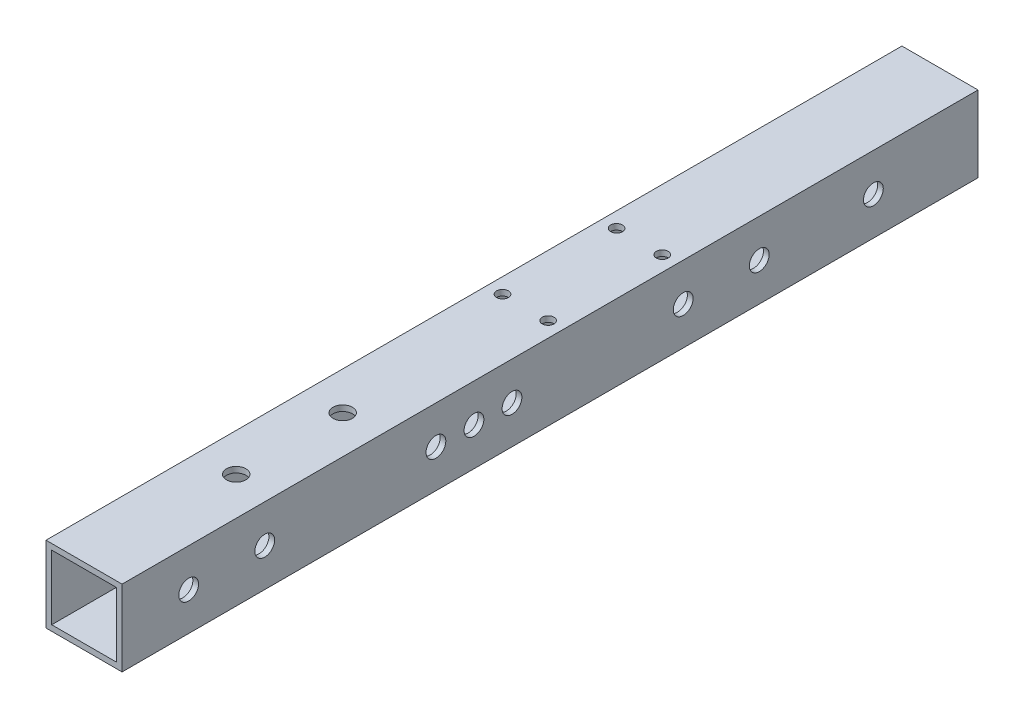
ISO-10303-21;
HEADER;
FILE_DESCRIPTION(('STEP AP214'),'2;1');
FILE_NAME('part.step','',(''),(''),'','','');
FILE_SCHEMA(('AUTOMOTIVE_DESIGN { 1 0 10303 214 1 1 1 1 }'));
ENDSEC;
DATA;
#1=APPLICATION_CONTEXT('core data for automotive mechanical design processes');
#2=APPLICATION_PROTOCOL_DEFINITION('international standard','automotive_design',2000,#1);
#3=PRODUCT_CONTEXT('',#1,'mechanical');
#4=PRODUCT('Part','Part','',(#3));
#5=PRODUCT_RELATED_PRODUCT_CATEGORY('part','',(#4));
#6=PRODUCT_DEFINITION_FORMATION('','',#4);
#7=PRODUCT_DEFINITION_CONTEXT('part definition',#1,'design');
#8=PRODUCT_DEFINITION('design','',#6,#7);
#9=PRODUCT_DEFINITION_SHAPE('','',#8);
#10=(LENGTH_UNIT() NAMED_UNIT(*) SI_UNIT(.MILLI.,.METRE.));
#11=(NAMED_UNIT(*) PLANE_ANGLE_UNIT() SI_UNIT($,.RADIAN.));
#12=(NAMED_UNIT(*) SI_UNIT($,.STERADIAN.) SOLID_ANGLE_UNIT());
#13=UNCERTAINTY_MEASURE_WITH_UNIT(LENGTH_MEASURE(1.E-05),#10,'distance_accuracy_value','');
#14=(GEOMETRIC_REPRESENTATION_CONTEXT(3) GLOBAL_UNCERTAINTY_ASSIGNED_CONTEXT((#13)) GLOBAL_UNIT_ASSIGNED_CONTEXT((#10,
#11,#12)) REPRESENTATION_CONTEXT('',''));
#15=CARTESIAN_POINT('',(0.,0.,0.));
#16=DIRECTION('',(0.,0.,1.));
#17=DIRECTION('',(1.,0.,0.));
#18=AXIS2_PLACEMENT_3D('',#15,#16,#17);
#19=CARTESIAN_POINT('',(0.,0.,112.5));
#20=DIRECTION('',(0.,0.,1.));
#21=DIRECTION('',(1.,0.,0.));
#22=AXIS2_PLACEMENT_3D('',#19,#20,#21);
#23=PLANE('',#22);
#24=DIRECTION('',(0.,1.,0.));
#25=VECTOR('',#24,1.);
#26=CARTESIAN_POINT('',(10.,10.,112.5));
#27=LINE('',#26,#25);
#28=CARTESIAN_POINT('',(10.,-10.,112.5));
#29=VERTEX_POINT('',#28);
#30=CARTESIAN_POINT('',(10.,10.,112.5));
#31=VERTEX_POINT('',#30);
#32=EDGE_CURVE('E142',#29,#31,#27,.T.);
#33=ORIENTED_EDGE('',*,*,#32,.T.);
#34=DIRECTION('',(-1.,0.,0.));
#35=VECTOR('',#34,1.);
#36=CARTESIAN_POINT('',(-10.,10.,112.5));
#37=LINE('',#36,#35);
#38=CARTESIAN_POINT('',(-10.,10.,112.5));
#39=VERTEX_POINT('',#38);
#40=EDGE_CURVE('E145',#31,#39,#37,.T.);
#41=ORIENTED_EDGE('',*,*,#40,.T.);
#42=DIRECTION('',(0.,-1.,0.));
#43=VECTOR('',#42,1.);
#44=CARTESIAN_POINT('',(-10.,10.,112.5));
#45=LINE('',#44,#43);
#46=CARTESIAN_POINT('',(-10.,-10.,112.5));
#47=VERTEX_POINT('',#46);
#48=EDGE_CURVE('E148',#39,#47,#45,.T.);
#49=ORIENTED_EDGE('',*,*,#48,.T.);
#50=DIRECTION('',(1.,0.,0.));
#51=VECTOR('',#50,1.);
#52=CARTESIAN_POINT('',(-10.,-10.,112.5));
#53=LINE('',#52,#51);
#54=EDGE_CURVE('E150',#47,#29,#53,.T.);
#55=ORIENTED_EDGE('',*,*,#54,.T.);
#56=EDGE_LOOP('',(#33,#41,#49,#55));
#57=FACE_BOUND('',#56,.T.);
#58=DIRECTION('',(1.,0.,0.));
#59=VECTOR('',#58,1.);
#60=CARTESIAN_POINT('',(-8.5,-8.5,112.5));
#61=LINE('',#60,#59);
#62=CARTESIAN_POINT('',(-8.5,-8.5,112.5));
#63=VERTEX_POINT('',#62);
#64=CARTESIAN_POINT('',(8.5,-8.5,112.5));
#65=VERTEX_POINT('',#64);
#66=EDGE_CURVE('E112',#63,#65,#61,.T.);
#67=ORIENTED_EDGE('',*,*,#66,.F.);
#68=DIRECTION('',(0.,-1.,0.));
#69=VECTOR('',#68,1.);
#70=CARTESIAN_POINT('',(-8.5,8.5,112.5));
#71=LINE('',#70,#69);
#72=CARTESIAN_POINT('',(-8.5,8.5,112.5));
#73=VERTEX_POINT('',#72);
#74=EDGE_CURVE('E104',#73,#63,#71,.T.);
#75=ORIENTED_EDGE('',*,*,#74,.F.);
#76=DIRECTION('',(-1.,0.,0.));
#77=VECTOR('',#76,1.);
#78=CARTESIAN_POINT('',(-8.5,8.5,112.5));
#79=LINE('',#78,#77);
#80=CARTESIAN_POINT('',(8.5,8.5,112.5));
#81=VERTEX_POINT('',#80);
#82=EDGE_CURVE('E126',#81,#73,#79,.T.);
#83=ORIENTED_EDGE('',*,*,#82,.F.);
#84=DIRECTION('',(0.,1.,0.));
#85=VECTOR('',#84,1.);
#86=CARTESIAN_POINT('',(8.5,8.5,112.5));
#87=LINE('',#86,#85);
#88=EDGE_CURVE('E124',#65,#81,#87,.T.);
#89=ORIENTED_EDGE('',*,*,#88,.F.);
#90=EDGE_LOOP('',(#67,#75,#83,#89));
#91=FACE_BOUND('',#90,.T.);
#92=ADVANCED_FACE('F37',(#57,#91),#23,.T.);
#93=CARTESIAN_POINT('',(0.,0.,-112.5));
#94=DIRECTION('',(0.,0.,1.));
#95=DIRECTION('',(1.,0.,0.));
#96=AXIS2_PLACEMENT_3D('',#93,#94,#95);
#97=PLANE('',#96);
#98=DIRECTION('',(0.,1.,0.));
#99=VECTOR('',#98,1.);
#100=CARTESIAN_POINT('',(10.,10.,-112.5));
#101=LINE('',#100,#99);
#102=CARTESIAN_POINT('',(10.,-10.,-112.5));
#103=VERTEX_POINT('',#102);
#104=CARTESIAN_POINT('',(10.,10.,-112.5));
#105=VERTEX_POINT('',#104);
#106=EDGE_CURVE('E120',#103,#105,#101,.T.);
#107=ORIENTED_EDGE('',*,*,#106,.F.);
#108=DIRECTION('',(1.,0.,0.));
#109=VECTOR('',#108,1.);
#110=CARTESIAN_POINT('',(-10.,-10.,-112.5));
#111=LINE('',#110,#109);
#112=CARTESIAN_POINT('',(-10.,-10.,-112.5));
#113=VERTEX_POINT('',#112);
#114=EDGE_CURVE('E146',#113,#103,#111,.T.);
#115=ORIENTED_EDGE('',*,*,#114,.F.);
#116=DIRECTION('',(0.,-1.,0.));
#117=VECTOR('',#116,1.);
#118=CARTESIAN_POINT('',(-10.,10.,-112.5));
#119=LINE('',#118,#117);
#120=CARTESIAN_POINT('',(-10.,10.,-112.5));
#121=VERTEX_POINT('',#120);
#122=EDGE_CURVE('E157',#121,#113,#119,.T.);
#123=ORIENTED_EDGE('',*,*,#122,.F.);
#124=DIRECTION('',(-1.,0.,0.));
#125=VECTOR('',#124,1.);
#126=CARTESIAN_POINT('',(-10.,10.,-112.5));
#127=LINE('',#126,#125);
#128=EDGE_CURVE('E155',#105,#121,#127,.T.);
#129=ORIENTED_EDGE('',*,*,#128,.F.);
#130=EDGE_LOOP('',(#107,#115,#123,#129));
#131=FACE_BOUND('',#130,.T.);
#132=DIRECTION('',(0.,-1.,0.));
#133=VECTOR('',#132,1.);
#134=CARTESIAN_POINT('',(-8.5,8.5,-112.5));
#135=LINE('',#134,#133);
#136=CARTESIAN_POINT('',(-8.5,8.5,-112.5));
#137=VERTEX_POINT('',#136);
#138=CARTESIAN_POINT('',(-8.5,-8.5,-112.5));
#139=VERTEX_POINT('',#138);
#140=EDGE_CURVE('E62',#137,#139,#135,.T.);
#141=ORIENTED_EDGE('',*,*,#140,.T.);
#142=DIRECTION('',(1.,0.,0.));
#143=VECTOR('',#142,1.);
#144=CARTESIAN_POINT('',(-8.5,-8.5,-112.5));
#145=LINE('',#144,#143);
#146=CARTESIAN_POINT('',(8.5,-8.5,-112.5));
#147=VERTEX_POINT('',#146);
#148=EDGE_CURVE('E119',#139,#147,#145,.T.);
#149=ORIENTED_EDGE('',*,*,#148,.T.);
#150=DIRECTION('',(0.,1.,0.));
#151=VECTOR('',#150,1.);
#152=CARTESIAN_POINT('',(8.5,8.5,-112.5));
#153=LINE('',#152,#151);
#154=CARTESIAN_POINT('',(8.5,8.5,-112.5));
#155=VERTEX_POINT('',#154);
#156=EDGE_CURVE('E134',#147,#155,#153,.T.);
#157=ORIENTED_EDGE('',*,*,#156,.T.);
#158=DIRECTION('',(-1.,0.,0.));
#159=VECTOR('',#158,1.);
#160=CARTESIAN_POINT('',(-8.5,8.5,-112.5));
#161=LINE('',#160,#159);
#162=EDGE_CURVE('E113',#155,#137,#161,.T.);
#163=ORIENTED_EDGE('',*,*,#162,.T.);
#164=EDGE_LOOP('',(#141,#149,#157,#163));
#165=FACE_BOUND('',#164,.T.);
#166=ADVANCED_FACE('F345',(#131,#165),#97,.F.);
#167=CARTESIAN_POINT('',(10.,10.,112.5));
#168=DIRECTION('',(-1.,0.,0.));
#169=DIRECTION('',(0.,-1.,0.));
#170=AXIS2_PLACEMENT_3D('',#167,#168,#169);
#171=PLANE('',#170);
#172=CARTESIAN_POINT('',(10.,0.,-85.0000000000001));
#173=DIRECTION('',(1.,0.,0.));
#174=DIRECTION('',(0.,1.,0.));
#175=AXIS2_PLACEMENT_3D('',#172,#173,#174);
#176=CIRCLE('',#175,2.59999999999999);
#177=CARTESIAN_POINT('',(10.,2.60000000000002,-85.0000000000001));
#178=VERTEX_POINT('',#177);
#179=EDGE_CURVE('E236',#178,#178,#176,.T.);
#180=ORIENTED_EDGE('',*,*,#179,.F.);
#181=EDGE_LOOP('',(#180));
#182=FACE_BOUND('',#181,.T.);
#183=CARTESIAN_POINT('',(10.,0.,-55.0000000000001));
#184=DIRECTION('',(1.,0.,0.));
#185=DIRECTION('',(0.,1.,0.));
#186=AXIS2_PLACEMENT_3D('',#183,#184,#185);
#187=CIRCLE('',#186,2.6);
#188=CARTESIAN_POINT('',(10.,2.60000000000002,-55.0000000000001));
#189=VERTEX_POINT('',#188);
#190=EDGE_CURVE('E242',#189,#189,#187,.T.);
#191=ORIENTED_EDGE('',*,*,#190,.F.);
#192=EDGE_LOOP('',(#191));
#193=FACE_BOUND('',#192,.T.);
#194=CARTESIAN_POINT('',(10.,0.,-35.0000000000001));
#195=DIRECTION('',(1.,0.,0.));
#196=DIRECTION('',(0.,1.,0.));
#197=AXIS2_PLACEMENT_3D('',#194,#195,#196);
#198=CIRCLE('',#197,2.6);
#199=CARTESIAN_POINT('',(10.,2.60000000000001,-35.0000000000001));
#200=VERTEX_POINT('',#199);
#201=EDGE_CURVE('E248',#200,#200,#198,.T.);
#202=ORIENTED_EDGE('',*,*,#201,.F.);
#203=EDGE_LOOP('',(#202));
#204=FACE_BOUND('',#203,.T.);
#205=CARTESIAN_POINT('',(10.,0.,9.99999999999994));
#206=DIRECTION('',(1.,0.,0.));
#207=DIRECTION('',(0.,1.,0.));
#208=AXIS2_PLACEMENT_3D('',#205,#206,#207);
#209=CIRCLE('',#208,2.6);
#210=CARTESIAN_POINT('',(10.,2.60000000000001,9.99999999999994));
#211=VERTEX_POINT('',#210);
#212=EDGE_CURVE('E254',#211,#211,#209,.T.);
#213=ORIENTED_EDGE('',*,*,#212,.F.);
#214=EDGE_LOOP('',(#213));
#215=FACE_BOUND('',#214,.T.);
#216=CARTESIAN_POINT('',(10.,0.,19.9999999999999));
#217=DIRECTION('',(1.,0.,0.));
#218=DIRECTION('',(0.,1.,0.));
#219=AXIS2_PLACEMENT_3D('',#216,#217,#218);
#220=CIRCLE('',#219,2.6);
#221=CARTESIAN_POINT('',(10.,2.6,19.9999999999999));
#222=VERTEX_POINT('',#221);
#223=EDGE_CURVE('E260',#222,#222,#220,.T.);
#224=ORIENTED_EDGE('',*,*,#223,.F.);
#225=EDGE_LOOP('',(#224));
#226=FACE_BOUND('',#225,.T.);
#227=CARTESIAN_POINT('',(10.,0.,29.9999999999999));
#228=DIRECTION('',(1.,0.,0.));
#229=DIRECTION('',(0.,1.,0.));
#230=AXIS2_PLACEMENT_3D('',#227,#228,#229);
#231=CIRCLE('',#230,2.6);
#232=CARTESIAN_POINT('',(10.,2.6,29.9999999999999));
#233=VERTEX_POINT('',#232);
#234=EDGE_CURVE('E266',#233,#233,#231,.T.);
#235=ORIENTED_EDGE('',*,*,#234,.F.);
#236=EDGE_LOOP('',(#235));
#237=FACE_BOUND('',#236,.T.);
#238=CARTESIAN_POINT('',(10.,0.,75.));
#239=DIRECTION('',(1.,0.,0.));
#240=DIRECTION('',(0.,1.,0.));
#241=AXIS2_PLACEMENT_3D('',#238,#239,#240);
#242=CIRCLE('',#241,2.6);
#243=CARTESIAN_POINT('',(10.,2.6,75.));
#244=VERTEX_POINT('',#243);
#245=EDGE_CURVE('E272',#244,#244,#242,.T.);
#246=ORIENTED_EDGE('',*,*,#245,.F.);
#247=EDGE_LOOP('',(#246));
#248=FACE_BOUND('',#247,.T.);
#249=CARTESIAN_POINT('',(10.,0.,95.));
#250=DIRECTION('',(1.,0.,0.));
#251=DIRECTION('',(0.,1.,0.));
#252=AXIS2_PLACEMENT_3D('',#249,#250,#251);
#253=CIRCLE('',#252,2.6);
#254=CARTESIAN_POINT('',(10.,2.59999999999999,95.));
#255=VERTEX_POINT('',#254);
#256=EDGE_CURVE('E233',#255,#255,#253,.T.);
#257=ORIENTED_EDGE('',*,*,#256,.F.);
#258=EDGE_LOOP('',(#257));
#259=FACE_BOUND('',#258,.T.);
#260=ORIENTED_EDGE('',*,*,#106,.T.);
#261=DIRECTION('',(0.,0.,-1.));
#262=VECTOR('',#261,1.);
#263=CARTESIAN_POINT('',(10.,10.,112.5));
#264=LINE('',#263,#262);
#265=EDGE_CURVE('E11',#31,#105,#264,.T.);
#266=ORIENTED_EDGE('',*,*,#265,.F.);
#267=ORIENTED_EDGE('',*,*,#32,.F.);
#268=DIRECTION('',(0.,0.,-1.));
#269=VECTOR('',#268,1.);
#270=CARTESIAN_POINT('',(10.,-10.,112.5));
#271=LINE('',#270,#269);
#272=EDGE_CURVE('E152',#29,#103,#271,.T.);
#273=ORIENTED_EDGE('',*,*,#272,.T.);
#274=EDGE_LOOP('',(#260,#266,#267,#273));
#275=FACE_BOUND('',#274,.T.);
#276=ADVANCED_FACE('F39',(#182,#193,#204,#215,#226,#237,#248,#259,#275),#171,.F.);
#277=CARTESIAN_POINT('',(-10.,10.,112.5));
#278=DIRECTION('',(0.,-1.,0.));
#279=DIRECTION('',(0.,0.,-1.));
#280=AXIS2_PLACEMENT_3D('',#277,#278,#279);
#281=PLANE('',#280);
#282=CARTESIAN_POINT('',(6.,10.,-3.5));
#283=DIRECTION('',(0.,1.,0.));
#284=DIRECTION('',(0.,0.,1.));
#285=AXIS2_PLACEMENT_3D('',#282,#283,#284);
#286=CIRCLE('',#285,1.55);
#287=CARTESIAN_POINT('',(6.,10.,-1.95));
#288=VERTEX_POINT('',#287);
#289=EDGE_CURVE('E469',#288,#288,#286,.T.);
#290=ORIENTED_EDGE('',*,*,#289,.F.);
#291=EDGE_LOOP('',(#290));
#292=FACE_BOUND('',#291,.T.);
#293=CARTESIAN_POINT('',(-6.,10.,-33.5));
#294=DIRECTION('',(0.,1.,0.));
#295=DIRECTION('',(0.,0.,1.));
#296=AXIS2_PLACEMENT_3D('',#293,#294,#295);
#297=CIRCLE('',#296,1.55);
#298=CARTESIAN_POINT('',(-6.,10.,-31.95));
#299=VERTEX_POINT('',#298);
#300=EDGE_CURVE('E456',#299,#299,#297,.T.);
#301=ORIENTED_EDGE('',*,*,#300,.F.);
#302=EDGE_LOOP('',(#301));
#303=FACE_BOUND('',#302,.T.);
#304=CARTESIAN_POINT('',(6.,10.,-33.5));
#305=DIRECTION('',(0.,1.,0.));
#306=DIRECTION('',(0.,0.,1.));
#307=AXIS2_PLACEMENT_3D('',#304,#305,#306);
#308=CIRCLE('',#307,1.55);
#309=CARTESIAN_POINT('',(6.,10.,-31.95));
#310=VERTEX_POINT('',#309);
#311=EDGE_CURVE('E457',#310,#310,#308,.T.);
#312=ORIENTED_EDGE('',*,*,#311,.F.);
#313=EDGE_LOOP('',(#312));
#314=FACE_BOUND('',#313,.T.);
#315=CARTESIAN_POINT('',(-6.,10.,-3.5));
#316=DIRECTION('',(0.,1.,0.));
#317=DIRECTION('',(0.,0.,1.));
#318=AXIS2_PLACEMENT_3D('',#315,#316,#317);
#319=CIRCLE('',#318,1.55);
#320=CARTESIAN_POINT('',(-6.,10.,-1.95));
#321=VERTEX_POINT('',#320);
#322=EDGE_CURVE('E468',#321,#321,#319,.T.);
#323=ORIENTED_EDGE('',*,*,#322,.F.);
#324=EDGE_LOOP('',(#323));
#325=FACE_BOUND('',#324,.T.);
#326=CARTESIAN_POINT('',(0.,10.,72.5000000000001));
#327=DIRECTION('',(0.,1.,0.));
#328=DIRECTION('',(0.,0.,1.));
#329=AXIS2_PLACEMENT_3D('',#326,#327,#328);
#330=CIRCLE('',#329,2.55);
#331=CARTESIAN_POINT('',(0.,10.,75.0500000000001));
#332=VERTEX_POINT('',#331);
#333=EDGE_CURVE('E299',#332,#332,#330,.T.);
#334=ORIENTED_EDGE('',*,*,#333,.F.);
#335=EDGE_LOOP('',(#334));
#336=FACE_BOUND('',#335,.T.);
#337=CARTESIAN_POINT('',(0.,10.,44.5000000000001));
#338=DIRECTION('',(0.,1.,0.));
#339=DIRECTION('',(0.,0.,1.));
#340=AXIS2_PLACEMENT_3D('',#337,#338,#339);
#341=CIRCLE('',#340,2.55);
#342=CARTESIAN_POINT('',(0.,10.,47.05));
#343=VERTEX_POINT('',#342);
#344=EDGE_CURVE('E296',#343,#343,#341,.T.);
#345=ORIENTED_EDGE('',*,*,#344,.F.);
#346=EDGE_LOOP('',(#345));
#347=FACE_BOUND('',#346,.T.);
#348=ORIENTED_EDGE('',*,*,#128,.T.);
#349=DIRECTION('',(0.,0.,-1.));
#350=VECTOR('',#349,1.);
#351=CARTESIAN_POINT('',(-10.,10.,112.5));
#352=LINE('',#351,#350);
#353=EDGE_CURVE('E46',#39,#121,#352,.T.);
#354=ORIENTED_EDGE('',*,*,#353,.F.);
#355=ORIENTED_EDGE('',*,*,#40,.F.);
#356=ORIENTED_EDGE('',*,*,#265,.T.);
#357=EDGE_LOOP('',(#348,#354,#355,#356));
#358=FACE_BOUND('',#357,.T.);
#359=ADVANCED_FACE('F349',(#292,#303,#314,#325,#336,#347,#358),#281,.F.);
#360=CARTESIAN_POINT('',(-10.,10.,112.5));
#361=DIRECTION('',(1.,0.,0.));
#362=DIRECTION('',(0.,1.,0.));
#363=AXIS2_PLACEMENT_3D('',#360,#361,#362);
#364=PLANE('',#363);
#365=CARTESIAN_POINT('',(-10.,0.,-85.0000000000001));
#366=DIRECTION('',(1.,0.,0.));
#367=DIRECTION('',(0.,1.,0.));
#368=AXIS2_PLACEMENT_3D('',#365,#366,#367);
#369=CIRCLE('',#368,2.59999999999999);
#370=CARTESIAN_POINT('',(-10.,2.60000000000002,-85.0000000000001));
#371=VERTEX_POINT('',#370);
#372=EDGE_CURVE('E179',#371,#371,#369,.T.);
#373=ORIENTED_EDGE('',*,*,#372,.T.);
#374=EDGE_LOOP('',(#373));
#375=FACE_BOUND('',#374,.T.);
#376=CARTESIAN_POINT('',(-10.,0.,-55.0000000000001));
#377=DIRECTION('',(1.,0.,0.));
#378=DIRECTION('',(0.,1.,0.));
#379=AXIS2_PLACEMENT_3D('',#376,#377,#378);
#380=CIRCLE('',#379,2.6);
#381=CARTESIAN_POINT('',(-10.,2.60000000000002,-55.0000000000001));
#382=VERTEX_POINT('',#381);
#383=EDGE_CURVE('E239',#382,#382,#380,.T.);
#384=ORIENTED_EDGE('',*,*,#383,.T.);
#385=EDGE_LOOP('',(#384));
#386=FACE_BOUND('',#385,.T.);
#387=CARTESIAN_POINT('',(-10.,0.,-35.0000000000001));
#388=DIRECTION('',(1.,0.,0.));
#389=DIRECTION('',(0.,1.,0.));
#390=AXIS2_PLACEMENT_3D('',#387,#388,#389);
#391=CIRCLE('',#390,2.6);
#392=CARTESIAN_POINT('',(-10.,2.60000000000001,-35.0000000000001));
#393=VERTEX_POINT('',#392);
#394=EDGE_CURVE('E245',#393,#393,#391,.T.);
#395=ORIENTED_EDGE('',*,*,#394,.T.);
#396=EDGE_LOOP('',(#395));
#397=FACE_BOUND('',#396,.T.);
#398=CARTESIAN_POINT('',(-10.,0.,9.99999999999994));
#399=DIRECTION('',(1.,0.,0.));
#400=DIRECTION('',(0.,1.,0.));
#401=AXIS2_PLACEMENT_3D('',#398,#399,#400);
#402=CIRCLE('',#401,2.6);
#403=CARTESIAN_POINT('',(-10.,2.6,9.99999999999994));
#404=VERTEX_POINT('',#403);
#405=EDGE_CURVE('E251',#404,#404,#402,.T.);
#406=ORIENTED_EDGE('',*,*,#405,.T.);
#407=EDGE_LOOP('',(#406));
#408=FACE_BOUND('',#407,.T.);
#409=CARTESIAN_POINT('',(-10.,0.,19.9999999999999));
#410=DIRECTION('',(1.,0.,0.));
#411=DIRECTION('',(0.,1.,0.));
#412=AXIS2_PLACEMENT_3D('',#409,#410,#411);
#413=CIRCLE('',#412,2.6);
#414=CARTESIAN_POINT('',(-10.,2.6,19.9999999999999));
#415=VERTEX_POINT('',#414);
#416=EDGE_CURVE('E257',#415,#415,#413,.T.);
#417=ORIENTED_EDGE('',*,*,#416,.T.);
#418=EDGE_LOOP('',(#417));
#419=FACE_BOUND('',#418,.T.);
#420=CARTESIAN_POINT('',(-10.,0.,29.9999999999999));
#421=DIRECTION('',(1.,0.,0.));
#422=DIRECTION('',(0.,1.,0.));
#423=AXIS2_PLACEMENT_3D('',#420,#421,#422);
#424=CIRCLE('',#423,2.6);
#425=CARTESIAN_POINT('',(-10.,2.6,29.9999999999999));
#426=VERTEX_POINT('',#425);
#427=EDGE_CURVE('E263',#426,#426,#424,.T.);
#428=ORIENTED_EDGE('',*,*,#427,.T.);
#429=EDGE_LOOP('',(#428));
#430=FACE_BOUND('',#429,.T.);
#431=CARTESIAN_POINT('',(-10.,0.,75.));
#432=DIRECTION('',(1.,0.,0.));
#433=DIRECTION('',(0.,1.,0.));
#434=AXIS2_PLACEMENT_3D('',#431,#432,#433);
#435=CIRCLE('',#434,2.6);
#436=CARTESIAN_POINT('',(-10.,2.6,75.));
#437=VERTEX_POINT('',#436);
#438=EDGE_CURVE('E269',#437,#437,#435,.T.);
#439=ORIENTED_EDGE('',*,*,#438,.T.);
#440=EDGE_LOOP('',(#439));
#441=FACE_BOUND('',#440,.T.);
#442=CARTESIAN_POINT('',(-10.,0.,95.));
#443=DIRECTION('',(1.,0.,0.));
#444=DIRECTION('',(0.,1.,0.));
#445=AXIS2_PLACEMENT_3D('',#442,#443,#444);
#446=CIRCLE('',#445,2.6);
#447=CARTESIAN_POINT('',(-10.,2.59999999999999,95.));
#448=VERTEX_POINT('',#447);
#449=EDGE_CURVE('E275',#448,#448,#446,.T.);
#450=ORIENTED_EDGE('',*,*,#449,.T.);
#451=EDGE_LOOP('',(#450));
#452=FACE_BOUND('',#451,.T.);
#453=ORIENTED_EDGE('',*,*,#122,.T.);
#454=DIRECTION('',(0.,0.,-1.));
#455=VECTOR('',#454,1.);
#456=CARTESIAN_POINT('',(-10.,-10.,112.5));
#457=LINE('',#456,#455);
#458=EDGE_CURVE('E162',#47,#113,#457,.T.);
#459=ORIENTED_EDGE('',*,*,#458,.F.);
#460=ORIENTED_EDGE('',*,*,#48,.F.);
#461=ORIENTED_EDGE('',*,*,#353,.T.);
#462=EDGE_LOOP('',(#453,#459,#460,#461));
#463=FACE_BOUND('',#462,.T.);
#464=ADVANCED_FACE('F332',(#375,#386,#397,#408,#419,#430,#441,#452,#463),#364,.F.);
#465=CARTESIAN_POINT('',(-10.,-10.,112.5));
#466=DIRECTION('',(0.,1.,0.));
#467=DIRECTION('',(0.,0.,1.));
#468=AXIS2_PLACEMENT_3D('',#465,#466,#467);
#469=PLANE('',#468);
#470=CARTESIAN_POINT('',(6.,-10.,-3.5));
#471=DIRECTION('',(0.,1.,0.));
#472=DIRECTION('',(0.,0.,1.));
#473=AXIS2_PLACEMENT_3D('',#470,#471,#472);
#474=CIRCLE('',#473,1.55);
#475=CARTESIAN_POINT('',(6.,-10.,-1.95));
#476=VERTEX_POINT('',#475);
#477=EDGE_CURVE('E465',#476,#476,#474,.T.);
#478=ORIENTED_EDGE('',*,*,#477,.T.);
#479=EDGE_LOOP('',(#478));
#480=FACE_BOUND('',#479,.T.);
#481=CARTESIAN_POINT('',(-6.,-10.,-33.5));
#482=DIRECTION('',(0.,1.,0.));
#483=DIRECTION('',(0.,0.,1.));
#484=AXIS2_PLACEMENT_3D('',#481,#482,#483);
#485=CIRCLE('',#484,1.55);
#486=CARTESIAN_POINT('',(-6.,-10.,-31.95));
#487=VERTEX_POINT('',#486);
#488=EDGE_CURVE('E460',#487,#487,#485,.T.);
#489=ORIENTED_EDGE('',*,*,#488,.T.);
#490=EDGE_LOOP('',(#489));
#491=FACE_BOUND('',#490,.T.);
#492=CARTESIAN_POINT('',(6.,-10.,-33.5));
#493=DIRECTION('',(0.,1.,0.));
#494=DIRECTION('',(0.,0.,1.));
#495=AXIS2_PLACEMENT_3D('',#492,#493,#494);
#496=CIRCLE('',#495,1.55);
#497=CARTESIAN_POINT('',(6.,-10.,-31.95));
#498=VERTEX_POINT('',#497);
#499=EDGE_CURVE('E454',#498,#498,#496,.T.);
#500=ORIENTED_EDGE('',*,*,#499,.T.);
#501=EDGE_LOOP('',(#500));
#502=FACE_BOUND('',#501,.T.);
#503=CARTESIAN_POINT('',(-6.,-10.,-3.5));
#504=DIRECTION('',(0.,1.,0.));
#505=DIRECTION('',(0.,0.,1.));
#506=AXIS2_PLACEMENT_3D('',#503,#504,#505);
#507=CIRCLE('',#506,1.55);
#508=CARTESIAN_POINT('',(-6.,-10.,-1.95));
#509=VERTEX_POINT('',#508);
#510=EDGE_CURVE('E212',#509,#509,#507,.T.);
#511=ORIENTED_EDGE('',*,*,#510,.T.);
#512=EDGE_LOOP('',(#511));
#513=FACE_BOUND('',#512,.T.);
#514=CARTESIAN_POINT('',(0.,-10.,72.5000000000001));
#515=DIRECTION('',(0.,1.,0.));
#516=DIRECTION('',(0.,0.,1.));
#517=AXIS2_PLACEMENT_3D('',#514,#515,#516);
#518=CIRCLE('',#517,2.55);
#519=CARTESIAN_POINT('',(0.,-10.,75.0500000000001));
#520=VERTEX_POINT('',#519);
#521=EDGE_CURVE('E171',#520,#520,#518,.T.);
#522=ORIENTED_EDGE('',*,*,#521,.T.);
#523=EDGE_LOOP('',(#522));
#524=FACE_BOUND('',#523,.T.);
#525=CARTESIAN_POINT('',(0.,-10.,44.5000000000001));
#526=DIRECTION('',(0.,1.,0.));
#527=DIRECTION('',(0.,0.,1.));
#528=AXIS2_PLACEMENT_3D('',#525,#526,#527);
#529=CIRCLE('',#528,2.55);
#530=CARTESIAN_POINT('',(0.,-10.,47.05));
#531=VERTEX_POINT('',#530);
#532=EDGE_CURVE('E302',#531,#531,#529,.T.);
#533=ORIENTED_EDGE('',*,*,#532,.T.);
#534=EDGE_LOOP('',(#533));
#535=FACE_BOUND('',#534,.T.);
#536=ORIENTED_EDGE('',*,*,#114,.T.);
#537=ORIENTED_EDGE('',*,*,#272,.F.);
#538=ORIENTED_EDGE('',*,*,#54,.F.);
#539=ORIENTED_EDGE('',*,*,#458,.T.);
#540=EDGE_LOOP('',(#536,#537,#538,#539));
#541=FACE_BOUND('',#540,.T.);
#542=ADVANCED_FACE('F329',(#480,#491,#502,#513,#524,#535,#541),#469,.F.);
#543=CARTESIAN_POINT('',(-8.5,8.5,112.5));
#544=DIRECTION('',(1.,0.,0.));
#545=DIRECTION('',(0.,0.,-1.));
#546=AXIS2_PLACEMENT_3D('',#543,#544,#545);
#547=PLANE('',#546);
#548=CARTESIAN_POINT('',(-8.5,0.,-85.0000000000001));
#549=DIRECTION('',(1.,0.,0.));
#550=DIRECTION('',(0.,0.,-1.));
#551=AXIS2_PLACEMENT_3D('',#548,#549,#550);
#552=CIRCLE('',#551,2.59999999999999);
#553=CARTESIAN_POINT('',(-8.5,0.,-87.6000000000001));
#554=VERTEX_POINT('',#553);
#555=EDGE_CURVE('E207',#554,#554,#552,.T.);
#556=ORIENTED_EDGE('',*,*,#555,.F.);
#557=EDGE_LOOP('',(#556));
#558=FACE_BOUND('',#557,.T.);
#559=CARTESIAN_POINT('',(-8.5,0.,-55.0000000000001));
#560=DIRECTION('',(1.,0.,0.));
#561=DIRECTION('',(0.,0.,-1.));
#562=AXIS2_PLACEMENT_3D('',#559,#560,#561);
#563=CIRCLE('',#562,2.6);
#564=CARTESIAN_POINT('',(-8.5,0.,-57.6000000000001));
#565=VERTEX_POINT('',#564);
#566=EDGE_CURVE('E203',#565,#565,#563,.T.);
#567=ORIENTED_EDGE('',*,*,#566,.F.);
#568=EDGE_LOOP('',(#567));
#569=FACE_BOUND('',#568,.T.);
#570=CARTESIAN_POINT('',(-8.5,0.,-35.0000000000001));
#571=DIRECTION('',(1.,0.,0.));
#572=DIRECTION('',(0.,0.,-1.));
#573=AXIS2_PLACEMENT_3D('',#570,#571,#572);
#574=CIRCLE('',#573,2.6);
#575=CARTESIAN_POINT('',(-8.5,0.,-37.6000000000001));
#576=VERTEX_POINT('',#575);
#577=EDGE_CURVE('E199',#576,#576,#574,.T.);
#578=ORIENTED_EDGE('',*,*,#577,.F.);
#579=EDGE_LOOP('',(#578));
#580=FACE_BOUND('',#579,.T.);
#581=CARTESIAN_POINT('',(-8.5,0.,9.99999999999994));
#582=DIRECTION('',(1.,0.,0.));
#583=DIRECTION('',(0.,0.,-1.));
#584=AXIS2_PLACEMENT_3D('',#581,#582,#583);
#585=CIRCLE('',#584,2.6);
#586=CARTESIAN_POINT('',(-8.5,0.,7.39999999999994));
#587=VERTEX_POINT('',#586);
#588=EDGE_CURVE('E195',#587,#587,#585,.T.);
#589=ORIENTED_EDGE('',*,*,#588,.F.);
#590=EDGE_LOOP('',(#589));
#591=FACE_BOUND('',#590,.T.);
#592=CARTESIAN_POINT('',(-8.5,0.,19.9999999999999));
#593=DIRECTION('',(1.,0.,0.));
#594=DIRECTION('',(0.,0.,-1.));
#595=AXIS2_PLACEMENT_3D('',#592,#593,#594);
#596=CIRCLE('',#595,2.6);
#597=CARTESIAN_POINT('',(-8.5,0.,17.3999999999999));
#598=VERTEX_POINT('',#597);
#599=EDGE_CURVE('E191',#598,#598,#596,.T.);
#600=ORIENTED_EDGE('',*,*,#599,.F.);
#601=EDGE_LOOP('',(#600));
#602=FACE_BOUND('',#601,.T.);
#603=CARTESIAN_POINT('',(-8.5,0.,29.9999999999999));
#604=DIRECTION('',(1.,0.,0.));
#605=DIRECTION('',(0.,0.,-1.));
#606=AXIS2_PLACEMENT_3D('',#603,#604,#605);
#607=CIRCLE('',#606,2.6);
#608=CARTESIAN_POINT('',(-8.5,0.,27.3999999999999));
#609=VERTEX_POINT('',#608);
#610=EDGE_CURVE('E187',#609,#609,#607,.T.);
#611=ORIENTED_EDGE('',*,*,#610,.F.);
#612=EDGE_LOOP('',(#611));
#613=FACE_BOUND('',#612,.T.);
#614=CARTESIAN_POINT('',(-8.5,0.,75.));
#615=DIRECTION('',(1.,0.,0.));
#616=DIRECTION('',(0.,0.,-1.));
#617=AXIS2_PLACEMENT_3D('',#614,#615,#616);
#618=CIRCLE('',#617,2.6);
#619=CARTESIAN_POINT('',(-8.5,0.,72.4));
#620=VERTEX_POINT('',#619);
#621=EDGE_CURVE('E183',#620,#620,#618,.T.);
#622=ORIENTED_EDGE('',*,*,#621,.F.);
#623=EDGE_LOOP('',(#622));
#624=FACE_BOUND('',#623,.T.);
#625=CARTESIAN_POINT('',(-8.5,0.,95.));
#626=DIRECTION('',(1.,0.,0.));
#627=DIRECTION('',(0.,0.,-1.));
#628=AXIS2_PLACEMENT_3D('',#625,#626,#627);
#629=CIRCLE('',#628,2.6);
#630=CARTESIAN_POINT('',(-8.5,0.,92.4));
#631=VERTEX_POINT('',#630);
#632=EDGE_CURVE('E178',#631,#631,#629,.T.);
#633=ORIENTED_EDGE('',*,*,#632,.F.);
#634=EDGE_LOOP('',(#633));
#635=FACE_BOUND('',#634,.T.);
#636=ORIENTED_EDGE('',*,*,#140,.F.);
#637=DIRECTION('',(0.,0.,-1.));
#638=VECTOR('',#637,1.);
#639=CARTESIAN_POINT('',(-8.5,8.5,112.5));
#640=LINE('',#639,#638);
#641=EDGE_CURVE('E108',#73,#137,#640,.T.);
#642=ORIENTED_EDGE('',*,*,#641,.F.);
#643=ORIENTED_EDGE('',*,*,#74,.T.);
#644=DIRECTION('',(0.,0.,-1.));
#645=VECTOR('',#644,1.);
#646=CARTESIAN_POINT('',(-8.5,-8.5,112.5));
#647=LINE('',#646,#645);
#648=EDGE_CURVE('E107',#63,#139,#647,.T.);
#649=ORIENTED_EDGE('',*,*,#648,.T.);
#650=EDGE_LOOP('',(#636,#642,#643,#649));
#651=FACE_BOUND('',#650,.T.);
#652=ADVANCED_FACE('F106',(#558,#569,#580,#591,#602,#613,#624,#635,#651),#547,.T.);
#653=CARTESIAN_POINT('',(-8.5,-8.5,112.5));
#654=DIRECTION('',(0.,1.,0.));
#655=DIRECTION('',(-1.,0.,0.));
#656=AXIS2_PLACEMENT_3D('',#653,#654,#655);
#657=PLANE('',#656);
#658=CARTESIAN_POINT('',(6.,-8.5,-3.5));
#659=DIRECTION('',(0.,1.,0.));
#660=DIRECTION('',(-1.,0.,0.));
#661=AXIS2_PLACEMENT_3D('',#658,#659,#660);
#662=CIRCLE('',#661,1.55);
#663=CARTESIAN_POINT('',(4.45,-8.5,-3.5));
#664=VERTEX_POINT('',#663);
#665=EDGE_CURVE('E230',#664,#664,#662,.T.);
#666=ORIENTED_EDGE('',*,*,#665,.F.);
#667=EDGE_LOOP('',(#666));
#668=FACE_BOUND('',#667,.T.);
#669=CARTESIAN_POINT('',(-6.,-8.5,-33.5));
#670=DIRECTION('',(0.,1.,0.));
#671=DIRECTION('',(-1.,0.,0.));
#672=AXIS2_PLACEMENT_3D('',#669,#670,#671);
#673=CIRCLE('',#672,1.55);
#674=CARTESIAN_POINT('',(-7.55,-8.5,-33.5));
#675=VERTEX_POINT('',#674);
#676=EDGE_CURVE('E218',#675,#675,#673,.T.);
#677=ORIENTED_EDGE('',*,*,#676,.F.);
#678=EDGE_LOOP('',(#677));
#679=FACE_BOUND('',#678,.T.);
#680=CARTESIAN_POINT('',(6.,-8.5,-33.5));
#681=DIRECTION('',(0.,1.,0.));
#682=DIRECTION('',(-1.,0.,0.));
#683=AXIS2_PLACEMENT_3D('',#680,#681,#682);
#684=CIRCLE('',#683,1.55);
#685=CARTESIAN_POINT('',(4.45,-8.5,-33.5));
#686=VERTEX_POINT('',#685);
#687=EDGE_CURVE('E215',#686,#686,#684,.T.);
#688=ORIENTED_EDGE('',*,*,#687,.F.);
#689=EDGE_LOOP('',(#688));
#690=FACE_BOUND('',#689,.T.);
#691=CARTESIAN_POINT('',(-6.,-8.5,-3.5));
#692=DIRECTION('',(0.,1.,0.));
#693=DIRECTION('',(-1.,0.,0.));
#694=AXIS2_PLACEMENT_3D('',#691,#692,#693);
#695=CIRCLE('',#694,1.55);
#696=CARTESIAN_POINT('',(-7.55,-8.5,-3.5));
#697=VERTEX_POINT('',#696);
#698=EDGE_CURVE('E211',#697,#697,#695,.T.);
#699=ORIENTED_EDGE('',*,*,#698,.F.);
#700=EDGE_LOOP('',(#699));
#701=FACE_BOUND('',#700,.T.);
#702=CARTESIAN_POINT('',(0.,-8.5,72.5000000000001));
#703=DIRECTION('',(0.,1.,0.));
#704=DIRECTION('',(-1.,0.,0.));
#705=AXIS2_PLACEMENT_3D('',#702,#703,#704);
#706=CIRCLE('',#705,2.55);
#707=CARTESIAN_POINT('',(-2.54999999999998,-8.5,72.5000000000001));
#708=VERTEX_POINT('',#707);
#709=EDGE_CURVE('E132',#708,#708,#706,.T.);
#710=ORIENTED_EDGE('',*,*,#709,.F.);
#711=EDGE_LOOP('',(#710));
#712=FACE_BOUND('',#711,.T.);
#713=CARTESIAN_POINT('',(0.,-8.5,44.5000000000001));
#714=DIRECTION('',(0.,1.,0.));
#715=DIRECTION('',(-1.,0.,0.));
#716=AXIS2_PLACEMENT_3D('',#713,#714,#715);
#717=CIRCLE('',#716,2.55);
#718=CARTESIAN_POINT('',(-2.54999999999998,-8.5,44.5000000000001));
#719=VERTEX_POINT('',#718);
#720=EDGE_CURVE('E170',#719,#719,#717,.T.);
#721=ORIENTED_EDGE('',*,*,#720,.F.);
#722=EDGE_LOOP('',(#721));
#723=FACE_BOUND('',#722,.T.);
#724=ORIENTED_EDGE('',*,*,#148,.F.);
#725=ORIENTED_EDGE('',*,*,#648,.F.);
#726=ORIENTED_EDGE('',*,*,#66,.T.);
#727=DIRECTION('',(0.,0.,-1.));
#728=VECTOR('',#727,1.);
#729=CARTESIAN_POINT('',(8.5,-8.5,112.5));
#730=LINE('',#729,#728);
#731=EDGE_CURVE('E121',#65,#147,#730,.T.);
#732=ORIENTED_EDGE('',*,*,#731,.T.);
#733=EDGE_LOOP('',(#724,#725,#726,#732));
#734=FACE_BOUND('',#733,.T.);
#735=ADVANCED_FACE('F116',(#668,#679,#690,#701,#712,#723,#734),#657,.T.);
#736=CARTESIAN_POINT('',(8.5,8.5,112.5));
#737=DIRECTION('',(-1.,0.,0.));
#738=DIRECTION('',(0.,-1.,0.));
#739=AXIS2_PLACEMENT_3D('',#736,#737,#738);
#740=PLANE('',#739);
#741=CARTESIAN_POINT('',(8.5,0.,-85.0000000000001));
#742=DIRECTION('',(-1.,0.,0.));
#743=DIRECTION('',(0.,-1.,0.));
#744=AXIS2_PLACEMENT_3D('',#741,#742,#743);
#745=CIRCLE('',#744,2.59999999999999);
#746=CARTESIAN_POINT('',(8.5,-2.59999999999996,-85.0000000000001));
#747=VERTEX_POINT('',#746);
#748=EDGE_CURVE('E204',#747,#747,#745,.T.);
#749=ORIENTED_EDGE('',*,*,#748,.F.);
#750=EDGE_LOOP('',(#749));
#751=FACE_BOUND('',#750,.T.);
#752=CARTESIAN_POINT('',(8.5,0.,-55.0000000000001));
#753=DIRECTION('',(-1.,0.,0.));
#754=DIRECTION('',(0.,-1.,0.));
#755=AXIS2_PLACEMENT_3D('',#752,#753,#754);
#756=CIRCLE('',#755,2.6);
#757=CARTESIAN_POINT('',(8.5,-2.59999999999997,-55.0000000000001));
#758=VERTEX_POINT('',#757);
#759=EDGE_CURVE('E200',#758,#758,#756,.T.);
#760=ORIENTED_EDGE('',*,*,#759,.F.);
#761=EDGE_LOOP('',(#760));
#762=FACE_BOUND('',#761,.T.);
#763=CARTESIAN_POINT('',(8.5,0.,-35.0000000000001));
#764=DIRECTION('',(-1.,0.,0.));
#765=DIRECTION('',(0.,-1.,0.));
#766=AXIS2_PLACEMENT_3D('',#763,#764,#765);
#767=CIRCLE('',#766,2.6);
#768=CARTESIAN_POINT('',(8.5,-2.59999999999998,-35.0000000000001));
#769=VERTEX_POINT('',#768);
#770=EDGE_CURVE('E196',#769,#769,#767,.T.);
#771=ORIENTED_EDGE('',*,*,#770,.F.);
#772=EDGE_LOOP('',(#771));
#773=FACE_BOUND('',#772,.T.);
#774=CARTESIAN_POINT('',(8.5,0.,9.99999999999994));
#775=DIRECTION('',(-1.,0.,0.));
#776=DIRECTION('',(0.,-1.,0.));
#777=AXIS2_PLACEMENT_3D('',#774,#775,#776);
#778=CIRCLE('',#777,2.6);
#779=CARTESIAN_POINT('',(8.5,-2.6,9.99999999999994));
#780=VERTEX_POINT('',#779);
#781=EDGE_CURVE('E192',#780,#780,#778,.T.);
#782=ORIENTED_EDGE('',*,*,#781,.F.);
#783=EDGE_LOOP('',(#782));
#784=FACE_BOUND('',#783,.T.);
#785=CARTESIAN_POINT('',(8.5,0.,19.9999999999999));
#786=DIRECTION('',(-1.,0.,0.));
#787=DIRECTION('',(0.,-1.,0.));
#788=AXIS2_PLACEMENT_3D('',#785,#786,#787);
#789=CIRCLE('',#788,2.6);
#790=CARTESIAN_POINT('',(8.5,-2.6,19.9999999999999));
#791=VERTEX_POINT('',#790);
#792=EDGE_CURVE('E188',#791,#791,#789,.T.);
#793=ORIENTED_EDGE('',*,*,#792,.F.);
#794=EDGE_LOOP('',(#793));
#795=FACE_BOUND('',#794,.T.);
#796=CARTESIAN_POINT('',(8.5,0.,29.9999999999999));
#797=DIRECTION('',(-1.,0.,0.));
#798=DIRECTION('',(0.,-1.,0.));
#799=AXIS2_PLACEMENT_3D('',#796,#797,#798);
#800=CIRCLE('',#799,2.6);
#801=CARTESIAN_POINT('',(8.5,-2.6,29.9999999999999));
#802=VERTEX_POINT('',#801);
#803=EDGE_CURVE('E184',#802,#802,#800,.T.);
#804=ORIENTED_EDGE('',*,*,#803,.F.);
#805=EDGE_LOOP('',(#804));
#806=FACE_BOUND('',#805,.T.);
#807=CARTESIAN_POINT('',(8.5,0.,75.));
#808=DIRECTION('',(-1.,0.,0.));
#809=DIRECTION('',(0.,-1.,0.));
#810=AXIS2_PLACEMENT_3D('',#807,#808,#809);
#811=CIRCLE('',#810,2.6);
#812=CARTESIAN_POINT('',(8.5,-2.60000000000001,75.));
#813=VERTEX_POINT('',#812);
#814=EDGE_CURVE('E180',#813,#813,#811,.T.);
#815=ORIENTED_EDGE('',*,*,#814,.F.);
#816=EDGE_LOOP('',(#815));
#817=FACE_BOUND('',#816,.T.);
#818=CARTESIAN_POINT('',(8.5,0.,95.));
#819=DIRECTION('',(-1.,0.,0.));
#820=DIRECTION('',(0.,-1.,0.));
#821=AXIS2_PLACEMENT_3D('',#818,#819,#820);
#822=CIRCLE('',#821,2.6);
#823=CARTESIAN_POINT('',(8.5,-2.60000000000001,95.));
#824=VERTEX_POINT('',#823);
#825=EDGE_CURVE('E175',#824,#824,#822,.T.);
#826=ORIENTED_EDGE('',*,*,#825,.F.);
#827=EDGE_LOOP('',(#826));
#828=FACE_BOUND('',#827,.T.);
#829=ORIENTED_EDGE('',*,*,#156,.F.);
#830=ORIENTED_EDGE('',*,*,#731,.F.);
#831=ORIENTED_EDGE('',*,*,#88,.T.);
#832=DIRECTION('',(0.,0.,-1.));
#833=VECTOR('',#832,1.);
#834=CARTESIAN_POINT('',(8.5,8.5,112.5));
#835=LINE('',#834,#833);
#836=EDGE_CURVE('E54',#81,#155,#835,.T.);
#837=ORIENTED_EDGE('',*,*,#836,.T.);
#838=EDGE_LOOP('',(#829,#830,#831,#837));
#839=FACE_BOUND('',#838,.T.);
#840=ADVANCED_FACE('F316',(#751,#762,#773,#784,#795,#806,#817,#828,#839),#740,.T.);
#841=CARTESIAN_POINT('',(-8.5,8.5,112.5));
#842=DIRECTION('',(0.,-1.,0.));
#843=DIRECTION('',(0.,0.,-1.));
#844=AXIS2_PLACEMENT_3D('',#841,#842,#843);
#845=PLANE('',#844);
#846=CARTESIAN_POINT('',(6.,8.5,-3.5));
#847=DIRECTION('',(0.,-1.,0.));
#848=DIRECTION('',(0.,0.,-1.));
#849=AXIS2_PLACEMENT_3D('',#846,#847,#848);
#850=CIRCLE('',#849,1.55);
#851=CARTESIAN_POINT('',(6.,8.5,-5.05));
#852=VERTEX_POINT('',#851);
#853=EDGE_CURVE('E41',#852,#852,#850,.T.);
#854=ORIENTED_EDGE('',*,*,#853,.F.);
#855=EDGE_LOOP('',(#854));
#856=FACE_BOUND('',#855,.T.);
#857=CARTESIAN_POINT('',(-6.,8.5,-33.5));
#858=DIRECTION('',(0.,-1.,0.));
#859=DIRECTION('',(0.,0.,-1.));
#860=AXIS2_PLACEMENT_3D('',#857,#858,#859);
#861=CIRCLE('',#860,1.55);
#862=CARTESIAN_POINT('',(-6.,8.5,-35.05));
#863=VERTEX_POINT('',#862);
#864=EDGE_CURVE('E216',#863,#863,#861,.T.);
#865=ORIENTED_EDGE('',*,*,#864,.F.);
#866=EDGE_LOOP('',(#865));
#867=FACE_BOUND('',#866,.T.);
#868=CARTESIAN_POINT('',(6.,8.5,-33.5));
#869=DIRECTION('',(0.,-1.,0.));
#870=DIRECTION('',(0.,0.,-1.));
#871=AXIS2_PLACEMENT_3D('',#868,#869,#870);
#872=CIRCLE('',#871,1.55);
#873=CARTESIAN_POINT('',(6.,8.5,-35.05));
#874=VERTEX_POINT('',#873);
#875=EDGE_CURVE('E213',#874,#874,#872,.T.);
#876=ORIENTED_EDGE('',*,*,#875,.F.);
#877=EDGE_LOOP('',(#876));
#878=FACE_BOUND('',#877,.T.);
#879=CARTESIAN_POINT('',(-6.,8.5,-3.5));
#880=DIRECTION('',(0.,-1.,0.));
#881=DIRECTION('',(0.,0.,-1.));
#882=AXIS2_PLACEMENT_3D('',#879,#880,#881);
#883=CIRCLE('',#882,1.55);
#884=CARTESIAN_POINT('',(-6.,8.5,-5.05));
#885=VERTEX_POINT('',#884);
#886=EDGE_CURVE('E208',#885,#885,#883,.T.);
#887=ORIENTED_EDGE('',*,*,#886,.F.);
#888=EDGE_LOOP('',(#887));
#889=FACE_BOUND('',#888,.T.);
#890=CARTESIAN_POINT('',(0.,8.5,72.5000000000001));
#891=DIRECTION('',(0.,-1.,0.));
#892=DIRECTION('',(0.,0.,-1.));
#893=AXIS2_PLACEMENT_3D('',#890,#891,#892);
#894=CIRCLE('',#893,2.55);
#895=CARTESIAN_POINT('',(0.,8.5,69.9500000000001));
#896=VERTEX_POINT('',#895);
#897=EDGE_CURVE('E172',#896,#896,#894,.T.);
#898=ORIENTED_EDGE('',*,*,#897,.F.);
#899=EDGE_LOOP('',(#898));
#900=FACE_BOUND('',#899,.T.);
#901=CARTESIAN_POINT('',(0.,8.5,44.5000000000001));
#902=DIRECTION('',(0.,-1.,0.));
#903=DIRECTION('',(0.,0.,-1.));
#904=AXIS2_PLACEMENT_3D('',#901,#902,#903);
#905=CIRCLE('',#904,2.55);
#906=CARTESIAN_POINT('',(0.,8.5,41.9500000000001));
#907=VERTEX_POINT('',#906);
#908=EDGE_CURVE('E167',#907,#907,#905,.T.);
#909=ORIENTED_EDGE('',*,*,#908,.F.);
#910=EDGE_LOOP('',(#909));
#911=FACE_BOUND('',#910,.T.);
#912=ORIENTED_EDGE('',*,*,#162,.F.);
#913=ORIENTED_EDGE('',*,*,#836,.F.);
#914=ORIENTED_EDGE('',*,*,#82,.T.);
#915=ORIENTED_EDGE('',*,*,#641,.T.);
#916=EDGE_LOOP('',(#912,#913,#914,#915));
#917=FACE_BOUND('',#916,.T.);
#918=ADVANCED_FACE('F373',(#856,#867,#878,#889,#900,#911,#917),#845,.T.);
#919=CARTESIAN_POINT('',(0.,-10.,44.5000000000001));
#920=DIRECTION('',(0.,1.,0.));
#921=DIRECTION('',(0.,0.,1.));
#922=AXIS2_PLACEMENT_3D('',#919,#920,#921);
#923=CYLINDRICAL_SURFACE('',#922,2.55);
#924=ORIENTED_EDGE('',*,*,#908,.T.);
#925=EDGE_LOOP('',(#924));
#926=FACE_BOUND('',#925,.T.);
#927=ORIENTED_EDGE('',*,*,#344,.T.);
#928=EDGE_LOOP('',(#927));
#929=FACE_BOUND('',#928,.T.);
#930=ADVANCED_FACE('F326',(#926,#929),#923,.F.);
#931=CARTESIAN_POINT('',(0.,-10.,72.5000000000001));
#932=DIRECTION('',(0.,1.,0.));
#933=DIRECTION('',(0.,0.,1.));
#934=AXIS2_PLACEMENT_3D('',#931,#932,#933);
#935=CYLINDRICAL_SURFACE('',#934,2.55);
#936=ORIENTED_EDGE('',*,*,#897,.T.);
#937=EDGE_LOOP('',(#936));
#938=FACE_BOUND('',#937,.T.);
#939=ORIENTED_EDGE('',*,*,#333,.T.);
#940=EDGE_LOOP('',(#939));
#941=FACE_BOUND('',#940,.T.);
#942=ADVANCED_FACE('F324',(#938,#941),#935,.F.);
#943=ORIENTED_EDGE('',*,*,#720,.T.);
#944=EDGE_LOOP('',(#943));
#945=FACE_BOUND('',#944,.T.);
#946=ORIENTED_EDGE('',*,*,#532,.F.);
#947=EDGE_LOOP('',(#946));
#948=FACE_BOUND('',#947,.T.);
#949=ADVANCED_FACE('F321',(#945,#948),#923,.F.);
#950=ORIENTED_EDGE('',*,*,#709,.T.);
#951=EDGE_LOOP('',(#950));
#952=FACE_BOUND('',#951,.T.);
#953=ORIENTED_EDGE('',*,*,#521,.F.);
#954=EDGE_LOOP('',(#953));
#955=FACE_BOUND('',#954,.T.);
#956=ADVANCED_FACE('F311',(#952,#955),#935,.F.);
#957=CARTESIAN_POINT('',(-10.,0.,95.));
#958=DIRECTION('',(1.,0.,0.));
#959=DIRECTION('',(0.,1.,0.));
#960=AXIS2_PLACEMENT_3D('',#957,#958,#959);
#961=CYLINDRICAL_SURFACE('',#960,2.6);
#962=ORIENTED_EDGE('',*,*,#825,.T.);
#963=EDGE_LOOP('',(#962));
#964=FACE_BOUND('',#963,.T.);
#965=ORIENTED_EDGE('',*,*,#256,.T.);
#966=EDGE_LOOP('',(#965));
#967=FACE_BOUND('',#966,.T.);
#968=ADVANCED_FACE('F383',(#964,#967),#961,.F.);
#969=CARTESIAN_POINT('',(-10.,0.,75.));
#970=DIRECTION('',(1.,0.,0.));
#971=DIRECTION('',(0.,1.,0.));
#972=AXIS2_PLACEMENT_3D('',#969,#970,#971);
#973=CYLINDRICAL_SURFACE('',#972,2.6);
#974=ORIENTED_EDGE('',*,*,#814,.T.);
#975=EDGE_LOOP('',(#974));
#976=FACE_BOUND('',#975,.T.);
#977=ORIENTED_EDGE('',*,*,#245,.T.);
#978=EDGE_LOOP('',(#977));
#979=FACE_BOUND('',#978,.T.);
#980=ADVANCED_FACE('F386',(#976,#979),#973,.F.);
#981=CARTESIAN_POINT('',(-10.,0.,29.9999999999999));
#982=DIRECTION('',(1.,0.,0.));
#983=DIRECTION('',(0.,1.,0.));
#984=AXIS2_PLACEMENT_3D('',#981,#982,#983);
#985=CYLINDRICAL_SURFACE('',#984,2.6);
#986=ORIENTED_EDGE('',*,*,#803,.T.);
#987=EDGE_LOOP('',(#986));
#988=FACE_BOUND('',#987,.T.);
#989=ORIENTED_EDGE('',*,*,#234,.T.);
#990=EDGE_LOOP('',(#989));
#991=FACE_BOUND('',#990,.T.);
#992=ADVANCED_FACE('F391',(#988,#991),#985,.F.);
#993=CARTESIAN_POINT('',(-10.,0.,19.9999999999999));
#994=DIRECTION('',(1.,0.,0.));
#995=DIRECTION('',(0.,1.,0.));
#996=AXIS2_PLACEMENT_3D('',#993,#994,#995);
#997=CYLINDRICAL_SURFACE('',#996,2.6);
#998=ORIENTED_EDGE('',*,*,#792,.T.);
#999=EDGE_LOOP('',(#998));
#1000=FACE_BOUND('',#999,.T.);
#1001=ORIENTED_EDGE('',*,*,#223,.T.);
#1002=EDGE_LOOP('',(#1001));
#1003=FACE_BOUND('',#1002,.T.);
#1004=ADVANCED_FACE('F396',(#1000,#1003),#997,.F.);
#1005=CARTESIAN_POINT('',(-10.,0.,9.99999999999994));
#1006=DIRECTION('',(1.,0.,0.));
#1007=DIRECTION('',(0.,1.,0.));
#1008=AXIS2_PLACEMENT_3D('',#1005,#1006,#1007);
#1009=CYLINDRICAL_SURFACE('',#1008,2.6);
#1010=ORIENTED_EDGE('',*,*,#781,.T.);
#1011=EDGE_LOOP('',(#1010));
#1012=FACE_BOUND('',#1011,.T.);
#1013=ORIENTED_EDGE('',*,*,#212,.T.);
#1014=EDGE_LOOP('',(#1013));
#1015=FACE_BOUND('',#1014,.T.);
#1016=ADVANCED_FACE('F401',(#1012,#1015),#1009,.F.);
#1017=CARTESIAN_POINT('',(-10.,0.,-35.0000000000001));
#1018=DIRECTION('',(1.,0.,0.));
#1019=DIRECTION('',(0.,1.,0.));
#1020=AXIS2_PLACEMENT_3D('',#1017,#1018,#1019);
#1021=CYLINDRICAL_SURFACE('',#1020,2.6);
#1022=ORIENTED_EDGE('',*,*,#770,.T.);
#1023=EDGE_LOOP('',(#1022));
#1024=FACE_BOUND('',#1023,.T.);
#1025=ORIENTED_EDGE('',*,*,#201,.T.);
#1026=EDGE_LOOP('',(#1025));
#1027=FACE_BOUND('',#1026,.T.);
#1028=ADVANCED_FACE('F406',(#1024,#1027),#1021,.F.);
#1029=CARTESIAN_POINT('',(-10.,0.,-55.0000000000001));
#1030=DIRECTION('',(1.,0.,0.));
#1031=DIRECTION('',(0.,1.,0.));
#1032=AXIS2_PLACEMENT_3D('',#1029,#1030,#1031);
#1033=CYLINDRICAL_SURFACE('',#1032,2.6);
#1034=ORIENTED_EDGE('',*,*,#759,.T.);
#1035=EDGE_LOOP('',(#1034));
#1036=FACE_BOUND('',#1035,.T.);
#1037=ORIENTED_EDGE('',*,*,#190,.T.);
#1038=EDGE_LOOP('',(#1037));
#1039=FACE_BOUND('',#1038,.T.);
#1040=ADVANCED_FACE('F411',(#1036,#1039),#1033,.F.);
#1041=CARTESIAN_POINT('',(-10.,0.,-85.0000000000001));
#1042=DIRECTION('',(1.,0.,0.));
#1043=DIRECTION('',(0.,1.,0.));
#1044=AXIS2_PLACEMENT_3D('',#1041,#1042,#1043);
#1045=CYLINDRICAL_SURFACE('',#1044,2.59999999999999);
#1046=ORIENTED_EDGE('',*,*,#748,.T.);
#1047=EDGE_LOOP('',(#1046));
#1048=FACE_BOUND('',#1047,.T.);
#1049=ORIENTED_EDGE('',*,*,#179,.T.);
#1050=EDGE_LOOP('',(#1049));
#1051=FACE_BOUND('',#1050,.T.);
#1052=ADVANCED_FACE('F416',(#1048,#1051),#1045,.F.);
#1053=ORIENTED_EDGE('',*,*,#632,.T.);
#1054=EDGE_LOOP('',(#1053));
#1055=FACE_BOUND('',#1054,.T.);
#1056=ORIENTED_EDGE('',*,*,#449,.F.);
#1057=EDGE_LOOP('',(#1056));
#1058=FACE_BOUND('',#1057,.T.);
#1059=ADVANCED_FACE('F388',(#1055,#1058),#961,.F.);
#1060=ORIENTED_EDGE('',*,*,#621,.T.);
#1061=EDGE_LOOP('',(#1060));
#1062=FACE_BOUND('',#1061,.T.);
#1063=ORIENTED_EDGE('',*,*,#438,.F.);
#1064=EDGE_LOOP('',(#1063));
#1065=FACE_BOUND('',#1064,.T.);
#1066=ADVANCED_FACE('F393',(#1062,#1065),#973,.F.);
#1067=ORIENTED_EDGE('',*,*,#610,.T.);
#1068=EDGE_LOOP('',(#1067));
#1069=FACE_BOUND('',#1068,.T.);
#1070=ORIENTED_EDGE('',*,*,#427,.F.);
#1071=EDGE_LOOP('',(#1070));
#1072=FACE_BOUND('',#1071,.T.);
#1073=ADVANCED_FACE('F398',(#1069,#1072),#985,.F.);
#1074=ORIENTED_EDGE('',*,*,#599,.T.);
#1075=EDGE_LOOP('',(#1074));
#1076=FACE_BOUND('',#1075,.T.);
#1077=ORIENTED_EDGE('',*,*,#416,.F.);
#1078=EDGE_LOOP('',(#1077));
#1079=FACE_BOUND('',#1078,.T.);
#1080=ADVANCED_FACE('F403',(#1076,#1079),#997,.F.);
#1081=ORIENTED_EDGE('',*,*,#588,.T.);
#1082=EDGE_LOOP('',(#1081));
#1083=FACE_BOUND('',#1082,.T.);
#1084=ORIENTED_EDGE('',*,*,#405,.F.);
#1085=EDGE_LOOP('',(#1084));
#1086=FACE_BOUND('',#1085,.T.);
#1087=ADVANCED_FACE('F408',(#1083,#1086),#1009,.F.);
#1088=ORIENTED_EDGE('',*,*,#577,.T.);
#1089=EDGE_LOOP('',(#1088));
#1090=FACE_BOUND('',#1089,.T.);
#1091=ORIENTED_EDGE('',*,*,#394,.F.);
#1092=EDGE_LOOP('',(#1091));
#1093=FACE_BOUND('',#1092,.T.);
#1094=ADVANCED_FACE('F413',(#1090,#1093),#1021,.F.);
#1095=ORIENTED_EDGE('',*,*,#566,.T.);
#1096=EDGE_LOOP('',(#1095));
#1097=FACE_BOUND('',#1096,.T.);
#1098=ORIENTED_EDGE('',*,*,#383,.F.);
#1099=EDGE_LOOP('',(#1098));
#1100=FACE_BOUND('',#1099,.T.);
#1101=ADVANCED_FACE('F418',(#1097,#1100),#1033,.F.);
#1102=ORIENTED_EDGE('',*,*,#555,.T.);
#1103=EDGE_LOOP('',(#1102));
#1104=FACE_BOUND('',#1103,.T.);
#1105=ORIENTED_EDGE('',*,*,#372,.F.);
#1106=EDGE_LOOP('',(#1105));
#1107=FACE_BOUND('',#1106,.T.);
#1108=ADVANCED_FACE('F422',(#1104,#1107),#1045,.F.);
#1109=CARTESIAN_POINT('',(-6.,-10.,-3.5));
#1110=DIRECTION('',(0.,1.,0.));
#1111=DIRECTION('',(0.,0.,1.));
#1112=AXIS2_PLACEMENT_3D('',#1109,#1110,#1111);
#1113=CYLINDRICAL_SURFACE('',#1112,1.55);
#1114=ORIENTED_EDGE('',*,*,#886,.T.);
#1115=EDGE_LOOP('',(#1114));
#1116=FACE_BOUND('',#1115,.T.);
#1117=ORIENTED_EDGE('',*,*,#322,.T.);
#1118=EDGE_LOOP('',(#1117));
#1119=FACE_BOUND('',#1118,.T.);
#1120=ADVANCED_FACE('F423',(#1116,#1119),#1113,.F.);
#1121=CARTESIAN_POINT('',(6.,-10.,-33.5));
#1122=DIRECTION('',(0.,1.,0.));
#1123=DIRECTION('',(0.,0.,1.));
#1124=AXIS2_PLACEMENT_3D('',#1121,#1122,#1123);
#1125=CYLINDRICAL_SURFACE('',#1124,1.55);
#1126=ORIENTED_EDGE('',*,*,#875,.T.);
#1127=EDGE_LOOP('',(#1126));
#1128=FACE_BOUND('',#1127,.T.);
#1129=ORIENTED_EDGE('',*,*,#311,.T.);
#1130=EDGE_LOOP('',(#1129));
#1131=FACE_BOUND('',#1130,.T.);
#1132=ADVANCED_FACE('F426',(#1128,#1131),#1125,.F.);
#1133=CARTESIAN_POINT('',(-6.,-10.,-33.5));
#1134=DIRECTION('',(0.,1.,0.));
#1135=DIRECTION('',(0.,0.,1.));
#1136=AXIS2_PLACEMENT_3D('',#1133,#1134,#1135);
#1137=CYLINDRICAL_SURFACE('',#1136,1.55);
#1138=ORIENTED_EDGE('',*,*,#864,.T.);
#1139=EDGE_LOOP('',(#1138));
#1140=FACE_BOUND('',#1139,.T.);
#1141=ORIENTED_EDGE('',*,*,#300,.T.);
#1142=EDGE_LOOP('',(#1141));
#1143=FACE_BOUND('',#1142,.T.);
#1144=ADVANCED_FACE('F429',(#1140,#1143),#1137,.F.);
#1145=CARTESIAN_POINT('',(6.,-10.,-3.5));
#1146=DIRECTION('',(0.,1.,0.));
#1147=DIRECTION('',(0.,0.,1.));
#1148=AXIS2_PLACEMENT_3D('',#1145,#1146,#1147);
#1149=CYLINDRICAL_SURFACE('',#1148,1.55);
#1150=ORIENTED_EDGE('',*,*,#853,.T.);
#1151=EDGE_LOOP('',(#1150));
#1152=FACE_BOUND('',#1151,.T.);
#1153=ORIENTED_EDGE('',*,*,#289,.T.);
#1154=EDGE_LOOP('',(#1153));
#1155=FACE_BOUND('',#1154,.T.);
#1156=ADVANCED_FACE('F432',(#1152,#1155),#1149,.F.);
#1157=ORIENTED_EDGE('',*,*,#698,.T.);
#1158=EDGE_LOOP('',(#1157));
#1159=FACE_BOUND('',#1158,.T.);
#1160=ORIENTED_EDGE('',*,*,#510,.F.);
#1161=EDGE_LOOP('',(#1160));
#1162=FACE_BOUND('',#1161,.T.);
#1163=ADVANCED_FACE('F428',(#1159,#1162),#1113,.F.);
#1164=ORIENTED_EDGE('',*,*,#687,.T.);
#1165=EDGE_LOOP('',(#1164));
#1166=FACE_BOUND('',#1165,.T.);
#1167=ORIENTED_EDGE('',*,*,#499,.F.);
#1168=EDGE_LOOP('',(#1167));
#1169=FACE_BOUND('',#1168,.T.);
#1170=ADVANCED_FACE('F440',(#1166,#1169),#1125,.F.);
#1171=ORIENTED_EDGE('',*,*,#676,.T.);
#1172=EDGE_LOOP('',(#1171));
#1173=FACE_BOUND('',#1172,.T.);
#1174=ORIENTED_EDGE('',*,*,#488,.F.);
#1175=EDGE_LOOP('',(#1174));
#1176=FACE_BOUND('',#1175,.T.);
#1177=ADVANCED_FACE('F433',(#1173,#1176),#1137,.F.);
#1178=ORIENTED_EDGE('',*,*,#665,.T.);
#1179=EDGE_LOOP('',(#1178));
#1180=FACE_BOUND('',#1179,.T.);
#1181=ORIENTED_EDGE('',*,*,#477,.F.);
#1182=EDGE_LOOP('',(#1181));
#1183=FACE_BOUND('',#1182,.T.);
#1184=ADVANCED_FACE('F437',(#1180,#1183),#1149,.F.);
#1185=CLOSED_SHELL('',(#92,#166,#276,#359,#464,#542,#652,#735,#840,#918,#930,#942,#949,#956,
#968,#980,#992,#1004,#1016,#1028,#1040,#1052,#1059,#1066,#1073,#1080,#1087,#1094,#1101,#1108,
#1120,#1132,#1144,#1156,#1163,#1170,#1177,#1184));
#1186=MANIFOLD_SOLID_BREP('B2',#1185);
#1187=ADVANCED_BREP_SHAPE_REPRESENTATION('',(#18,#1186),#14);
#1188=SHAPE_DEFINITION_REPRESENTATION(#9,#1187);
ENDSEC;
END-ISO-10303-21;
